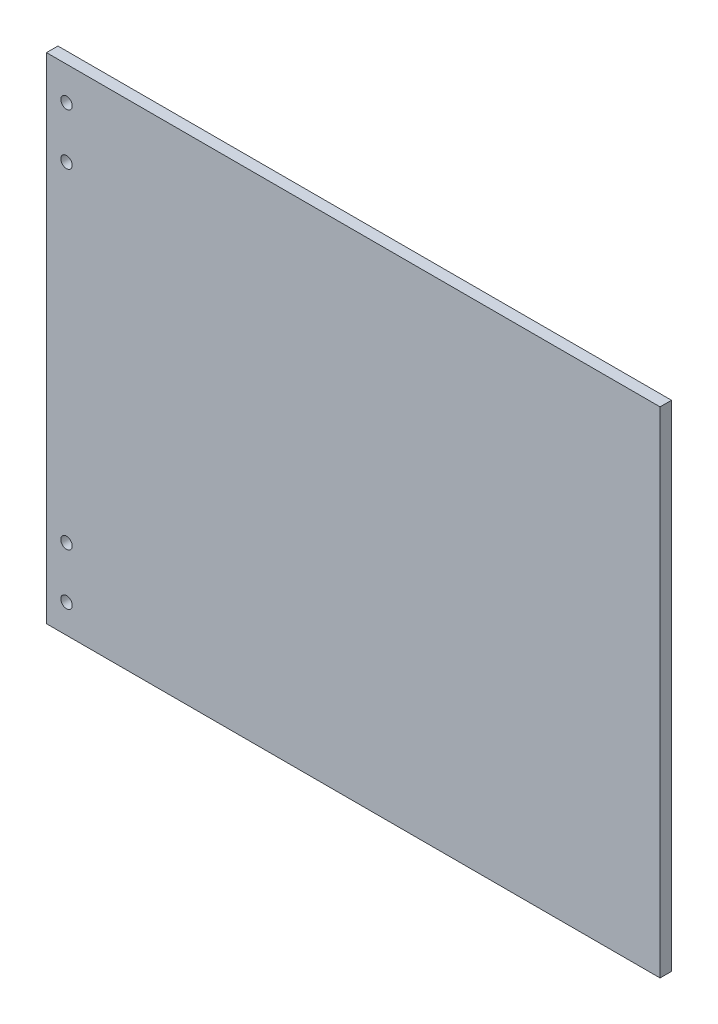
ISO-10303-21;
HEADER;
FILE_DESCRIPTION(('STEP AP214'),'2;1');
FILE_NAME('part.step','',(''),(''),'','','');
FILE_SCHEMA(('AUTOMOTIVE_DESIGN { 1 0 10303 214 1 1 1 1 }'));
ENDSEC;
DATA;
#1=APPLICATION_CONTEXT('core data for automotive mechanical design processes');
#2=APPLICATION_PROTOCOL_DEFINITION('international standard','automotive_design',2000,#1);
#3=PRODUCT_CONTEXT('',#1,'mechanical');
#4=PRODUCT('Part','Part','',(#3));
#5=PRODUCT_RELATED_PRODUCT_CATEGORY('part','',(#4));
#6=PRODUCT_DEFINITION_FORMATION('','',#4);
#7=PRODUCT_DEFINITION_CONTEXT('part definition',#1,'design');
#8=PRODUCT_DEFINITION('design','',#6,#7);
#9=PRODUCT_DEFINITION_SHAPE('','',#8);
#10=(LENGTH_UNIT() NAMED_UNIT(*) SI_UNIT(.MILLI.,.METRE.));
#11=(NAMED_UNIT(*) PLANE_ANGLE_UNIT() SI_UNIT($,.RADIAN.));
#12=(NAMED_UNIT(*) SI_UNIT($,.STERADIAN.) SOLID_ANGLE_UNIT());
#13=UNCERTAINTY_MEASURE_WITH_UNIT(LENGTH_MEASURE(1.E-05),#10,'distance_accuracy_value','');
#14=(GEOMETRIC_REPRESENTATION_CONTEXT(3) GLOBAL_UNCERTAINTY_ASSIGNED_CONTEXT((#13)) GLOBAL_UNIT_ASSIGNED_CONTEXT((#10,
#11,#12)) REPRESENTATION_CONTEXT('',''));
#15=CARTESIAN_POINT('',(0.,0.,0.));
#16=DIRECTION('',(0.,0.,1.));
#17=DIRECTION('',(1.,0.,0.));
#18=AXIS2_PLACEMENT_3D('',#15,#16,#17);
#19=CARTESIAN_POINT('',(-5.94461538461539,-5.94461538461539,6.));
#20=DIRECTION('',(1.,0.,0.));
#21=DIRECTION('',(0.,0.,-1.));
#22=AXIS2_PLACEMENT_3D('',#19,#20,#21);
#23=PLANE('',#22);
#24=DIRECTION('',(0.,-1.,0.));
#25=VECTOR('',#24,1.);
#26=CARTESIAN_POINT('',(-5.94461538461539,-5.94461538461539,0.));
#27=LINE('',#26,#25);
#28=CARTESIAN_POINT('',(-5.94461538461539,253.636923076923,0.));
#29=VERTEX_POINT('',#28);
#30=CARTESIAN_POINT('',(-5.94461538461539,-5.94461538461539,0.));
#31=VERTEX_POINT('',#30);
#32=EDGE_CURVE('E96',#29,#31,#27,.T.);
#33=ORIENTED_EDGE('',*,*,#32,.T.);
#34=DIRECTION('',(0.,0.,-1.));
#35=VECTOR('',#34,1.);
#36=CARTESIAN_POINT('',(-5.94461538461539,-5.94461538461539,6.));
#37=LINE('',#36,#35);
#38=CARTESIAN_POINT('',(-5.94461538461539,-5.94461538461539,6.));
#39=VERTEX_POINT('',#38);
#40=EDGE_CURVE('E11',#39,#31,#37,.T.);
#41=ORIENTED_EDGE('',*,*,#40,.F.);
#42=DIRECTION('',(0.,-1.,0.));
#43=VECTOR('',#42,1.);
#44=CARTESIAN_POINT('',(-5.94461538461539,-5.94461538461539,6.));
#45=LINE('',#44,#43);
#46=CARTESIAN_POINT('',(-5.94461538461539,253.636923076923,6.));
#47=VERTEX_POINT('',#46);
#48=EDGE_CURVE('E84',#47,#39,#45,.T.);
#49=ORIENTED_EDGE('',*,*,#48,.F.);
#50=DIRECTION('',(0.,0.,-1.));
#51=VECTOR('',#50,1.);
#52=CARTESIAN_POINT('',(-5.94461538461539,253.636923076923,6.));
#53=LINE('',#52,#51);
#54=EDGE_CURVE('E92',#47,#29,#53,.T.);
#55=ORIENTED_EDGE('',*,*,#54,.T.);
#56=EDGE_LOOP('',(#33,#41,#49,#55));
#57=FACE_BOUND('',#56,.T.);
#58=ADVANCED_FACE('F33',(#57),#23,.F.);
#59=CARTESIAN_POINT('',(-5.94461538461539,-5.94461538461539,6.));
#60=DIRECTION('',(0.,1.,0.));
#61=DIRECTION('',(0.,0.,1.));
#62=AXIS2_PLACEMENT_3D('',#59,#60,#61);
#63=PLANE('',#62);
#64=DIRECTION('',(1.,0.,0.));
#65=VECTOR('',#64,1.);
#66=CARTESIAN_POINT('',(-5.94461538461539,-5.94461538461539,0.));
#67=LINE('',#66,#65);
#68=CARTESIAN_POINT('',(316.055384615385,-5.94461538461539,0.));
#69=VERTEX_POINT('',#68);
#70=EDGE_CURVE('E88',#31,#69,#67,.T.);
#71=ORIENTED_EDGE('',*,*,#70,.T.);
#72=DIRECTION('',(0.,0.,-1.));
#73=VECTOR('',#72,1.);
#74=CARTESIAN_POINT('',(316.055384615385,-5.94461538461539,6.));
#75=LINE('',#74,#73);
#76=CARTESIAN_POINT('',(316.055384615385,-5.94461538461539,6.));
#77=VERTEX_POINT('',#76);
#78=EDGE_CURVE('E41',#77,#69,#75,.T.);
#79=ORIENTED_EDGE('',*,*,#78,.F.);
#80=DIRECTION('',(1.,0.,0.));
#81=VECTOR('',#80,1.);
#82=CARTESIAN_POINT('',(-5.94461538461539,-5.94461538461539,6.));
#83=LINE('',#82,#81);
#84=EDGE_CURVE('E79',#39,#77,#83,.T.);
#85=ORIENTED_EDGE('',*,*,#84,.F.);
#86=ORIENTED_EDGE('',*,*,#40,.T.);
#87=EDGE_LOOP('',(#71,#79,#85,#86));
#88=FACE_BOUND('',#87,.T.);
#89=ADVANCED_FACE('F87',(#88),#63,.F.);
#90=CARTESIAN_POINT('',(316.055384615385,-5.94461538461539,6.));
#91=DIRECTION('',(-1.,0.,0.));
#92=DIRECTION('',(0.,0.,1.));
#93=AXIS2_PLACEMENT_3D('',#90,#91,#92);
#94=PLANE('',#93);
#95=DIRECTION('',(0.,1.,0.));
#96=VECTOR('',#95,1.);
#97=CARTESIAN_POINT('',(316.055384615385,-5.94461538461539,0.));
#98=LINE('',#97,#96);
#99=CARTESIAN_POINT('',(316.055384615385,253.636923076923,0.));
#100=VERTEX_POINT('',#99);
#101=EDGE_CURVE('E66',#69,#100,#98,.T.);
#102=ORIENTED_EDGE('',*,*,#101,.T.);
#103=DIRECTION('',(0.,0.,-1.));
#104=VECTOR('',#103,1.);
#105=CARTESIAN_POINT('',(316.055384615385,253.636923076923,6.));
#106=LINE('',#105,#104);
#107=CARTESIAN_POINT('',(316.055384615385,253.636923076923,6.));
#108=VERTEX_POINT('',#107);
#109=EDGE_CURVE('E89',#108,#100,#106,.T.);
#110=ORIENTED_EDGE('',*,*,#109,.F.);
#111=DIRECTION('',(0.,1.,0.));
#112=VECTOR('',#111,1.);
#113=CARTESIAN_POINT('',(316.055384615385,-5.94461538461539,6.));
#114=LINE('',#113,#112);
#115=EDGE_CURVE('E82',#77,#108,#114,.T.);
#116=ORIENTED_EDGE('',*,*,#115,.F.);
#117=ORIENTED_EDGE('',*,*,#78,.T.);
#118=EDGE_LOOP('',(#102,#110,#116,#117));
#119=FACE_BOUND('',#118,.T.);
#120=ADVANCED_FACE('F90',(#119),#94,.F.);
#121=CARTESIAN_POINT('',(-5.94461538461539,253.636923076923,6.));
#122=DIRECTION('',(0.,-1.,0.));
#123=DIRECTION('',(0.,0.,-1.));
#124=AXIS2_PLACEMENT_3D('',#121,#122,#123);
#125=PLANE('',#124);
#126=DIRECTION('',(-1.,0.,0.));
#127=VECTOR('',#126,1.);
#128=CARTESIAN_POINT('',(-5.94461538461539,253.636923076923,0.));
#129=LINE('',#128,#127);
#130=EDGE_CURVE('E72',#100,#29,#129,.T.);
#131=ORIENTED_EDGE('',*,*,#130,.T.);
#132=ORIENTED_EDGE('',*,*,#54,.F.);
#133=DIRECTION('',(-1.,0.,0.));
#134=VECTOR('',#133,1.);
#135=CARTESIAN_POINT('',(-5.94461538461539,253.636923076923,6.));
#136=LINE('',#135,#134);
#137=EDGE_CURVE('E49',#108,#47,#136,.T.);
#138=ORIENTED_EDGE('',*,*,#137,.F.);
#139=ORIENTED_EDGE('',*,*,#109,.T.);
#140=EDGE_LOOP('',(#131,#132,#138,#139));
#141=FACE_BOUND('',#140,.T.);
#142=ADVANCED_FACE('F104',(#141),#125,.F.);
#143=CARTESIAN_POINT('',(0.,0.,6.));
#144=DIRECTION('',(0.,0.,-1.));
#145=DIRECTION('',(-1.,0.,0.));
#146=AXIS2_PLACEMENT_3D('',#143,#144,#145);
#147=PLANE('',#146);
#148=CARTESIAN_POINT('',(4.55538461538469,236.136923076923,6.));
#149=DIRECTION('',(0.,0.,-1.));
#150=DIRECTION('',(-1.,0.,0.));
#151=AXIS2_PLACEMENT_3D('',#148,#149,#150);
#152=CIRCLE('',#151,3.);
#153=CARTESIAN_POINT('',(1.55538461538469,236.136923076923,6.));
#154=VERTEX_POINT('',#153);
#155=EDGE_CURVE('E99',#154,#154,#152,.F.);
#156=ORIENTED_EDGE('',*,*,#155,.F.);
#157=EDGE_LOOP('',(#156));
#158=FACE_BOUND('',#157,.T.);
#159=CARTESIAN_POINT('',(4.55538461538469,209.136923076923,6.));
#160=DIRECTION('',(0.,0.,-1.));
#161=DIRECTION('',(-1.,0.,0.));
#162=AXIS2_PLACEMENT_3D('',#159,#160,#161);
#163=CIRCLE('',#162,3.);
#164=CARTESIAN_POINT('',(1.55538461538469,209.136923076923,6.));
#165=VERTEX_POINT('',#164);
#166=EDGE_CURVE('E123',#165,#165,#163,.F.);
#167=ORIENTED_EDGE('',*,*,#166,.F.);
#168=EDGE_LOOP('',(#167));
#169=FACE_BOUND('',#168,.T.);
#170=CARTESIAN_POINT('',(4.55538461538468,36.1369230769232,6.));
#171=DIRECTION('',(0.,0.,-1.));
#172=DIRECTION('',(-1.,0.,0.));
#173=AXIS2_PLACEMENT_3D('',#170,#171,#172);
#174=CIRCLE('',#173,3.);
#175=CARTESIAN_POINT('',(1.55538461538468,36.1369230769232,6.));
#176=VERTEX_POINT('',#175);
#177=EDGE_CURVE('E117',#176,#176,#174,.F.);
#178=ORIENTED_EDGE('',*,*,#177,.F.);
#179=EDGE_LOOP('',(#178));
#180=FACE_BOUND('',#179,.T.);
#181=CARTESIAN_POINT('',(4.55538461538468,9.13692307692324,6.));
#182=DIRECTION('',(0.,0.,-1.));
#183=DIRECTION('',(-1.,0.,0.));
#184=AXIS2_PLACEMENT_3D('',#181,#182,#183);
#185=CIRCLE('',#184,3.);
#186=CARTESIAN_POINT('',(1.55538461538468,9.13692307692324,6.));
#187=VERTEX_POINT('',#186);
#188=EDGE_CURVE('E110',#187,#187,#185,.F.);
#189=ORIENTED_EDGE('',*,*,#188,.F.);
#190=EDGE_LOOP('',(#189));
#191=FACE_BOUND('',#190,.T.);
#192=ORIENTED_EDGE('',*,*,#48,.T.);
#193=ORIENTED_EDGE('',*,*,#84,.T.);
#194=ORIENTED_EDGE('',*,*,#115,.T.);
#195=ORIENTED_EDGE('',*,*,#137,.T.);
#196=EDGE_LOOP('',(#192,#193,#194,#195));
#197=FACE_BOUND('',#196,.T.);
#198=ADVANCED_FACE('F80',(#158,#169,#180,#191,#197),#147,.F.);
#199=CARTESIAN_POINT('',(0.,0.,0.));
#200=DIRECTION('',(0.,0.,-1.));
#201=DIRECTION('',(-1.,0.,0.));
#202=AXIS2_PLACEMENT_3D('',#199,#200,#201);
#203=PLANE('',#202);
#204=CARTESIAN_POINT('',(4.55538461538469,236.136923076923,0.));
#205=DIRECTION('',(0.,0.,-1.));
#206=DIRECTION('',(-1.,0.,0.));
#207=AXIS2_PLACEMENT_3D('',#204,#205,#206);
#208=CIRCLE('',#207,3.);
#209=CARTESIAN_POINT('',(1.55538461538469,236.136923076923,0.));
#210=VERTEX_POINT('',#209);
#211=EDGE_CURVE('E126',#210,#210,#208,.T.);
#212=ORIENTED_EDGE('',*,*,#211,.F.);
#213=EDGE_LOOP('',(#212));
#214=FACE_BOUND('',#213,.T.);
#215=CARTESIAN_POINT('',(4.55538461538469,209.136923076923,0.));
#216=DIRECTION('',(0.,0.,-1.));
#217=DIRECTION('',(-1.,0.,0.));
#218=AXIS2_PLACEMENT_3D('',#215,#216,#217);
#219=CIRCLE('',#218,3.);
#220=CARTESIAN_POINT('',(1.55538461538469,209.136923076923,0.));
#221=VERTEX_POINT('',#220);
#222=EDGE_CURVE('E120',#221,#221,#219,.T.);
#223=ORIENTED_EDGE('',*,*,#222,.F.);
#224=EDGE_LOOP('',(#223));
#225=FACE_BOUND('',#224,.T.);
#226=CARTESIAN_POINT('',(4.55538461538468,36.1369230769232,0.));
#227=DIRECTION('',(0.,0.,-1.));
#228=DIRECTION('',(-1.,0.,0.));
#229=AXIS2_PLACEMENT_3D('',#226,#227,#228);
#230=CIRCLE('',#229,3.);
#231=CARTESIAN_POINT('',(1.55538461538468,36.1369230769232,0.));
#232=VERTEX_POINT('',#231);
#233=EDGE_CURVE('E113',#232,#232,#230,.T.);
#234=ORIENTED_EDGE('',*,*,#233,.F.);
#235=EDGE_LOOP('',(#234));
#236=FACE_BOUND('',#235,.T.);
#237=CARTESIAN_POINT('',(4.55538461538468,9.13692307692324,0.));
#238=DIRECTION('',(0.,0.,-1.));
#239=DIRECTION('',(-1.,0.,0.));
#240=AXIS2_PLACEMENT_3D('',#237,#238,#239);
#241=CIRCLE('',#240,3.);
#242=CARTESIAN_POINT('',(1.55538461538468,9.13692307692324,0.));
#243=VERTEX_POINT('',#242);
#244=EDGE_CURVE('E114',#243,#243,#241,.T.);
#245=ORIENTED_EDGE('',*,*,#244,.F.);
#246=EDGE_LOOP('',(#245));
#247=FACE_BOUND('',#246,.T.);
#248=ORIENTED_EDGE('',*,*,#32,.F.);
#249=ORIENTED_EDGE('',*,*,#130,.F.);
#250=ORIENTED_EDGE('',*,*,#101,.F.);
#251=ORIENTED_EDGE('',*,*,#70,.F.);
#252=EDGE_LOOP('',(#248,#249,#250,#251));
#253=FACE_BOUND('',#252,.T.);
#254=ADVANCED_FACE('F107',(#214,#225,#236,#247,#253),#203,.T.);
#255=CARTESIAN_POINT('',(4.55538461538468,9.13692307692324,6.001));
#256=DIRECTION('',(0.,0.,-1.));
#257=DIRECTION('',(-1.,0.,0.));
#258=AXIS2_PLACEMENT_3D('',#255,#256,#257);
#259=CYLINDRICAL_SURFACE('',#258,3.);
#260=CARTESIAN_POINT('',(1.55538461538468,9.13692307692324,0.));
#261=CARTESIAN_POINT('',(1.55538461538468,9.13692307692324,0.0625000000000001));
#262=CARTESIAN_POINT('',(1.55538461538468,9.13692307692324,0.125));
#263=CARTESIAN_POINT('',(1.55538461538468,9.13692307692324,0.25));
#264=CARTESIAN_POINT('',(1.55538461538468,9.13692307692324,0.3125));
#265=CARTESIAN_POINT('',(1.55538461538468,9.13692307692324,0.4375));
#266=CARTESIAN_POINT('',(1.55538461538468,9.13692307692324,0.5));
#267=CARTESIAN_POINT('',(1.55538461538468,9.13692307692324,0.625000000000001));
#268=CARTESIAN_POINT('',(1.55538461538468,9.13692307692324,0.687500000000001));
#269=CARTESIAN_POINT('',(1.55538461538468,9.13692307692324,0.8125));
#270=CARTESIAN_POINT('',(1.55538461538468,9.13692307692324,0.875));
#271=CARTESIAN_POINT('',(1.55538461538468,9.13692307692324,1.));
#272=CARTESIAN_POINT('',(1.55538461538468,9.13692307692324,1.0625));
#273=CARTESIAN_POINT('',(1.55538461538468,9.13692307692324,1.1875));
#274=CARTESIAN_POINT('',(1.55538461538468,9.13692307692324,1.25));
#275=CARTESIAN_POINT('',(1.55538461538468,9.13692307692324,1.375));
#276=CARTESIAN_POINT('',(1.55538461538468,9.13692307692324,1.4375));
#277=CARTESIAN_POINT('',(1.55538461538468,9.13692307692324,1.5625));
#278=CARTESIAN_POINT('',(1.55538461538468,9.13692307692324,1.625));
#279=CARTESIAN_POINT('',(1.55538461538468,9.13692307692324,1.75));
#280=CARTESIAN_POINT('',(1.55538461538468,9.13692307692324,1.8125));
#281=CARTESIAN_POINT('',(1.55538461538468,9.13692307692324,1.9375));
#282=CARTESIAN_POINT('',(1.55538461538468,9.13692307692324,2.));
#283=CARTESIAN_POINT('',(1.55538461538468,9.13692307692324,2.125));
#284=CARTESIAN_POINT('',(1.55538461538468,9.13692307692324,2.1875));
#285=CARTESIAN_POINT('',(1.55538461538468,9.13692307692324,2.3125));
#286=CARTESIAN_POINT('',(1.55538461538468,9.13692307692324,2.375));
#287=CARTESIAN_POINT('',(1.55538461538468,9.13692307692324,2.5));
#288=CARTESIAN_POINT('',(1.55538461538468,9.13692307692324,2.5625));
#289=CARTESIAN_POINT('',(1.55538461538468,9.13692307692324,2.6875));
#290=CARTESIAN_POINT('',(1.55538461538468,9.13692307692324,2.75));
#291=CARTESIAN_POINT('',(1.55538461538468,9.13692307692324,2.875));
#292=CARTESIAN_POINT('',(1.55538461538468,9.13692307692324,2.9375));
#293=CARTESIAN_POINT('',(1.55538461538468,9.13692307692324,3.0625));
#294=CARTESIAN_POINT('',(1.55538461538468,9.13692307692324,3.125));
#295=CARTESIAN_POINT('',(1.55538461538468,9.13692307692324,3.25));
#296=CARTESIAN_POINT('',(1.55538461538468,9.13692307692324,3.3125));
#297=CARTESIAN_POINT('',(1.55538461538468,9.13692307692324,3.4375));
#298=CARTESIAN_POINT('',(1.55538461538468,9.13692307692324,3.5));
#299=CARTESIAN_POINT('',(1.55538461538468,9.13692307692324,3.625));
#300=CARTESIAN_POINT('',(1.55538461538468,9.13692307692324,3.6875));
#301=CARTESIAN_POINT('',(1.55538461538468,9.13692307692324,3.8125));
#302=CARTESIAN_POINT('',(1.55538461538468,9.13692307692324,3.875));
#303=CARTESIAN_POINT('',(1.55538461538468,9.13692307692324,4.));
#304=CARTESIAN_POINT('',(1.55538461538468,9.13692307692324,4.0625));
#305=CARTESIAN_POINT('',(1.55538461538468,9.13692307692324,4.1875));
#306=CARTESIAN_POINT('',(1.55538461538468,9.13692307692324,4.25));
#307=CARTESIAN_POINT('',(1.55538461538468,9.13692307692324,4.375));
#308=CARTESIAN_POINT('',(1.55538461538468,9.13692307692324,4.4375));
#309=CARTESIAN_POINT('',(1.55538461538468,9.13692307692324,4.5625));
#310=CARTESIAN_POINT('',(1.55538461538468,9.13692307692324,4.625));
#311=CARTESIAN_POINT('',(1.55538461538468,9.13692307692324,4.75));
#312=CARTESIAN_POINT('',(1.55538461538468,9.13692307692324,4.8125));
#313=CARTESIAN_POINT('',(1.55538461538468,9.13692307692324,4.9375));
#314=CARTESIAN_POINT('',(1.55538461538468,9.13692307692324,5.));
#315=CARTESIAN_POINT('',(1.55538461538468,9.13692307692324,5.125));
#316=CARTESIAN_POINT('',(1.55538461538468,9.13692307692324,5.1875));
#317=CARTESIAN_POINT('',(1.55538461538468,9.13692307692324,5.3125));
#318=CARTESIAN_POINT('',(1.55538461538468,9.13692307692324,5.375));
#319=CARTESIAN_POINT('',(1.55538461538468,9.13692307692324,5.5));
#320=CARTESIAN_POINT('',(1.55538461538468,9.13692307692324,5.5625));
#321=CARTESIAN_POINT('',(1.55538461538468,9.13692307692324,5.6875));
#322=CARTESIAN_POINT('',(1.55538461538468,9.13692307692324,5.75));
#323=CARTESIAN_POINT('',(1.55538461538468,9.13692307692324,5.875));
#324=CARTESIAN_POINT('',(1.55538461538468,9.13692307692324,5.9375));
#325=CARTESIAN_POINT('',(1.55538461538468,9.13692307692324,6.));
#326=B_SPLINE_CURVE_WITH_KNOTS('',3,(#260,#261,#262,#263,#264,#265,#266,#267,#268,#269,#270,
#271,#272,#273,#274,#275,#276,#277,#278,#279,#280,#281,#282,#283,#284,#285,#286,#287,#288,#289,
#290,#291,#292,#293,#294,#295,#296,#297,#298,#299,#300,#301,#302,#303,#304,#305,#306,#307,#308,
#309,#310,#311,#312,#313,#314,#315,#316,#317,#318,#319,#320,#321,#322,#323,#324,#325),
.UNSPECIFIED.,.F.,.F.,(4,2,2,2,2,2,2,2,2,2,2,2,2,2,2,2,2,2,2,2,2,2,2,2,2,2,2,2,2,2,2,2,4),(0.,
0.1875,0.375,0.5625,0.750000000000001,0.9375,1.125,1.3125,1.5,1.6875,1.875,2.0625,2.25,2.4375,
2.625,2.8125,3.,3.1875,3.375,3.5625,3.75,3.9375,4.125,4.3125,4.5,4.6875,4.875,5.0625,5.25,
5.4375,5.625,5.8125,6.),.UNSPECIFIED.);
#327=EDGE_CURVE('BSEAM139',#243,#187,#326,.T.);
#328=ORIENTED_EDGE('',*,*,#244,.T.);
#329=ORIENTED_EDGE('',*,*,#188,.T.);
#330=ORIENTED_EDGE('',*,*,#327,.T.);
#331=ORIENTED_EDGE('',*,*,#327,.F.);
#332=EDGE_LOOP('',(#328,#330,#329,#331));
#333=FACE_BOUND('',#332,.T.);
#334=ADVANCED_FACE('F139',(#333),#259,.F.);
#335=CARTESIAN_POINT('',(4.55538461538468,36.1369230769232,6.001));
#336=DIRECTION('',(0.,0.,-1.));
#337=DIRECTION('',(-1.,0.,0.));
#338=AXIS2_PLACEMENT_3D('',#335,#336,#337);
#339=CYLINDRICAL_SURFACE('',#338,3.);
#340=CARTESIAN_POINT('',(1.55538461538468,36.1369230769232,0.));
#341=CARTESIAN_POINT('',(1.55538461538468,36.1369230769232,0.0625000000000001));
#342=CARTESIAN_POINT('',(1.55538461538468,36.1369230769232,0.125));
#343=CARTESIAN_POINT('',(1.55538461538468,36.1369230769232,0.25));
#344=CARTESIAN_POINT('',(1.55538461538468,36.1369230769232,0.3125));
#345=CARTESIAN_POINT('',(1.55538461538468,36.1369230769232,0.4375));
#346=CARTESIAN_POINT('',(1.55538461538468,36.1369230769232,0.5));
#347=CARTESIAN_POINT('',(1.55538461538468,36.1369230769232,0.625000000000001));
#348=CARTESIAN_POINT('',(1.55538461538468,36.1369230769232,0.687500000000001));
#349=CARTESIAN_POINT('',(1.55538461538468,36.1369230769232,0.8125));
#350=CARTESIAN_POINT('',(1.55538461538468,36.1369230769232,0.875));
#351=CARTESIAN_POINT('',(1.55538461538468,36.1369230769232,1.));
#352=CARTESIAN_POINT('',(1.55538461538468,36.1369230769232,1.0625));
#353=CARTESIAN_POINT('',(1.55538461538468,36.1369230769232,1.1875));
#354=CARTESIAN_POINT('',(1.55538461538468,36.1369230769232,1.25));
#355=CARTESIAN_POINT('',(1.55538461538468,36.1369230769232,1.375));
#356=CARTESIAN_POINT('',(1.55538461538468,36.1369230769232,1.4375));
#357=CARTESIAN_POINT('',(1.55538461538468,36.1369230769232,1.5625));
#358=CARTESIAN_POINT('',(1.55538461538468,36.1369230769232,1.625));
#359=CARTESIAN_POINT('',(1.55538461538468,36.1369230769232,1.75));
#360=CARTESIAN_POINT('',(1.55538461538468,36.1369230769232,1.8125));
#361=CARTESIAN_POINT('',(1.55538461538468,36.1369230769232,1.9375));
#362=CARTESIAN_POINT('',(1.55538461538468,36.1369230769232,2.));
#363=CARTESIAN_POINT('',(1.55538461538468,36.1369230769232,2.125));
#364=CARTESIAN_POINT('',(1.55538461538468,36.1369230769232,2.1875));
#365=CARTESIAN_POINT('',(1.55538461538468,36.1369230769232,2.3125));
#366=CARTESIAN_POINT('',(1.55538461538468,36.1369230769232,2.375));
#367=CARTESIAN_POINT('',(1.55538461538468,36.1369230769232,2.5));
#368=CARTESIAN_POINT('',(1.55538461538468,36.1369230769232,2.5625));
#369=CARTESIAN_POINT('',(1.55538461538468,36.1369230769232,2.6875));
#370=CARTESIAN_POINT('',(1.55538461538468,36.1369230769232,2.75));
#371=CARTESIAN_POINT('',(1.55538461538468,36.1369230769232,2.875));
#372=CARTESIAN_POINT('',(1.55538461538468,36.1369230769232,2.9375));
#373=CARTESIAN_POINT('',(1.55538461538468,36.1369230769232,3.0625));
#374=CARTESIAN_POINT('',(1.55538461538468,36.1369230769232,3.125));
#375=CARTESIAN_POINT('',(1.55538461538468,36.1369230769232,3.25));
#376=CARTESIAN_POINT('',(1.55538461538468,36.1369230769232,3.3125));
#377=CARTESIAN_POINT('',(1.55538461538468,36.1369230769232,3.4375));
#378=CARTESIAN_POINT('',(1.55538461538468,36.1369230769232,3.5));
#379=CARTESIAN_POINT('',(1.55538461538468,36.1369230769232,3.625));
#380=CARTESIAN_POINT('',(1.55538461538468,36.1369230769232,3.6875));
#381=CARTESIAN_POINT('',(1.55538461538468,36.1369230769232,3.8125));
#382=CARTESIAN_POINT('',(1.55538461538468,36.1369230769232,3.875));
#383=CARTESIAN_POINT('',(1.55538461538468,36.1369230769232,4.));
#384=CARTESIAN_POINT('',(1.55538461538468,36.1369230769232,4.0625));
#385=CARTESIAN_POINT('',(1.55538461538468,36.1369230769232,4.1875));
#386=CARTESIAN_POINT('',(1.55538461538468,36.1369230769232,4.25));
#387=CARTESIAN_POINT('',(1.55538461538468,36.1369230769232,4.375));
#388=CARTESIAN_POINT('',(1.55538461538468,36.1369230769232,4.4375));
#389=CARTESIAN_POINT('',(1.55538461538468,36.1369230769232,4.5625));
#390=CARTESIAN_POINT('',(1.55538461538468,36.1369230769232,4.625));
#391=CARTESIAN_POINT('',(1.55538461538468,36.1369230769232,4.75));
#392=CARTESIAN_POINT('',(1.55538461538468,36.1369230769232,4.8125));
#393=CARTESIAN_POINT('',(1.55538461538468,36.1369230769232,4.9375));
#394=CARTESIAN_POINT('',(1.55538461538468,36.1369230769232,5.));
#395=CARTESIAN_POINT('',(1.55538461538468,36.1369230769232,5.125));
#396=CARTESIAN_POINT('',(1.55538461538468,36.1369230769232,5.1875));
#397=CARTESIAN_POINT('',(1.55538461538468,36.1369230769232,5.3125));
#398=CARTESIAN_POINT('',(1.55538461538468,36.1369230769232,5.375));
#399=CARTESIAN_POINT('',(1.55538461538468,36.1369230769232,5.5));
#400=CARTESIAN_POINT('',(1.55538461538468,36.1369230769232,5.5625));
#401=CARTESIAN_POINT('',(1.55538461538468,36.1369230769232,5.6875));
#402=CARTESIAN_POINT('',(1.55538461538468,36.1369230769232,5.75));
#403=CARTESIAN_POINT('',(1.55538461538468,36.1369230769232,5.875));
#404=CARTESIAN_POINT('',(1.55538461538468,36.1369230769232,5.9375));
#405=CARTESIAN_POINT('',(1.55538461538468,36.1369230769232,6.));
#406=B_SPLINE_CURVE_WITH_KNOTS('',3,(#340,#341,#342,#343,#344,#345,#346,#347,#348,#349,#350,
#351,#352,#353,#354,#355,#356,#357,#358,#359,#360,#361,#362,#363,#364,#365,#366,#367,#368,#369,
#370,#371,#372,#373,#374,#375,#376,#377,#378,#379,#380,#381,#382,#383,#384,#385,#386,#387,#388,
#389,#390,#391,#392,#393,#394,#395,#396,#397,#398,#399,#400,#401,#402,#403,#404,#405),
.UNSPECIFIED.,.F.,.F.,(4,2,2,2,2,2,2,2,2,2,2,2,2,2,2,2,2,2,2,2,2,2,2,2,2,2,2,2,2,2,2,2,4),(0.,
0.1875,0.375,0.5625,0.750000000000001,0.9375,1.125,1.3125,1.5,1.6875,1.875,2.0625,2.25,2.4375,
2.625,2.8125,3.,3.1875,3.375,3.5625,3.75,3.9375,4.125,4.3125,4.5,4.6875,4.875,5.0625,5.25,
5.4375,5.625,5.8125,6.),.UNSPECIFIED.);
#407=EDGE_CURVE('BSEAM149',#232,#176,#406,.T.);
#408=ORIENTED_EDGE('',*,*,#233,.T.);
#409=ORIENTED_EDGE('',*,*,#177,.T.);
#410=ORIENTED_EDGE('',*,*,#407,.T.);
#411=ORIENTED_EDGE('',*,*,#407,.F.);
#412=EDGE_LOOP('',(#408,#410,#409,#411));
#413=FACE_BOUND('',#412,.T.);
#414=ADVANCED_FACE('F149',(#413),#339,.F.);
#415=CARTESIAN_POINT('',(4.55538461538469,209.136923076923,6.001));
#416=DIRECTION('',(0.,0.,-1.));
#417=DIRECTION('',(-1.,0.,0.));
#418=AXIS2_PLACEMENT_3D('',#415,#416,#417);
#419=CYLINDRICAL_SURFACE('',#418,3.);
#420=CARTESIAN_POINT('',(1.55538461538469,209.136923076923,0.));
#421=CARTESIAN_POINT('',(1.55538461538469,209.136923076923,0.0625000000000001));
#422=CARTESIAN_POINT('',(1.55538461538469,209.136923076923,0.125));
#423=CARTESIAN_POINT('',(1.55538461538469,209.136923076923,0.25));
#424=CARTESIAN_POINT('',(1.55538461538469,209.136923076923,0.3125));
#425=CARTESIAN_POINT('',(1.55538461538469,209.136923076923,0.4375));
#426=CARTESIAN_POINT('',(1.55538461538469,209.136923076923,0.5));
#427=CARTESIAN_POINT('',(1.55538461538469,209.136923076923,0.625000000000001));
#428=CARTESIAN_POINT('',(1.55538461538469,209.136923076923,0.687500000000001));
#429=CARTESIAN_POINT('',(1.55538461538469,209.136923076923,0.8125));
#430=CARTESIAN_POINT('',(1.55538461538469,209.136923076923,0.875));
#431=CARTESIAN_POINT('',(1.55538461538469,209.136923076923,1.));
#432=CARTESIAN_POINT('',(1.55538461538469,209.136923076923,1.0625));
#433=CARTESIAN_POINT('',(1.55538461538469,209.136923076923,1.1875));
#434=CARTESIAN_POINT('',(1.55538461538469,209.136923076923,1.25));
#435=CARTESIAN_POINT('',(1.55538461538469,209.136923076923,1.375));
#436=CARTESIAN_POINT('',(1.55538461538469,209.136923076923,1.4375));
#437=CARTESIAN_POINT('',(1.55538461538469,209.136923076923,1.5625));
#438=CARTESIAN_POINT('',(1.55538461538469,209.136923076923,1.625));
#439=CARTESIAN_POINT('',(1.55538461538469,209.136923076923,1.75));
#440=CARTESIAN_POINT('',(1.55538461538469,209.136923076923,1.8125));
#441=CARTESIAN_POINT('',(1.55538461538469,209.136923076923,1.9375));
#442=CARTESIAN_POINT('',(1.55538461538469,209.136923076923,2.));
#443=CARTESIAN_POINT('',(1.55538461538469,209.136923076923,2.125));
#444=CARTESIAN_POINT('',(1.55538461538469,209.136923076923,2.1875));
#445=CARTESIAN_POINT('',(1.55538461538469,209.136923076923,2.3125));
#446=CARTESIAN_POINT('',(1.55538461538469,209.136923076923,2.375));
#447=CARTESIAN_POINT('',(1.55538461538469,209.136923076923,2.5));
#448=CARTESIAN_POINT('',(1.55538461538469,209.136923076923,2.5625));
#449=CARTESIAN_POINT('',(1.55538461538469,209.136923076923,2.6875));
#450=CARTESIAN_POINT('',(1.55538461538469,209.136923076923,2.75));
#451=CARTESIAN_POINT('',(1.55538461538469,209.136923076923,2.875));
#452=CARTESIAN_POINT('',(1.55538461538469,209.136923076923,2.9375));
#453=CARTESIAN_POINT('',(1.55538461538469,209.136923076923,3.0625));
#454=CARTESIAN_POINT('',(1.55538461538469,209.136923076923,3.125));
#455=CARTESIAN_POINT('',(1.55538461538469,209.136923076923,3.25));
#456=CARTESIAN_POINT('',(1.55538461538469,209.136923076923,3.3125));
#457=CARTESIAN_POINT('',(1.55538461538469,209.136923076923,3.4375));
#458=CARTESIAN_POINT('',(1.55538461538469,209.136923076923,3.5));
#459=CARTESIAN_POINT('',(1.55538461538469,209.136923076923,3.625));
#460=CARTESIAN_POINT('',(1.55538461538469,209.136923076923,3.6875));
#461=CARTESIAN_POINT('',(1.55538461538469,209.136923076923,3.8125));
#462=CARTESIAN_POINT('',(1.55538461538469,209.136923076923,3.875));
#463=CARTESIAN_POINT('',(1.55538461538469,209.136923076923,4.));
#464=CARTESIAN_POINT('',(1.55538461538469,209.136923076923,4.0625));
#465=CARTESIAN_POINT('',(1.55538461538469,209.136923076923,4.1875));
#466=CARTESIAN_POINT('',(1.55538461538469,209.136923076923,4.25));
#467=CARTESIAN_POINT('',(1.55538461538469,209.136923076923,4.375));
#468=CARTESIAN_POINT('',(1.55538461538469,209.136923076923,4.4375));
#469=CARTESIAN_POINT('',(1.55538461538469,209.136923076923,4.5625));
#470=CARTESIAN_POINT('',(1.55538461538469,209.136923076923,4.625));
#471=CARTESIAN_POINT('',(1.55538461538469,209.136923076923,4.75));
#472=CARTESIAN_POINT('',(1.55538461538469,209.136923076923,4.8125));
#473=CARTESIAN_POINT('',(1.55538461538469,209.136923076923,4.9375));
#474=CARTESIAN_POINT('',(1.55538461538469,209.136923076923,5.));
#475=CARTESIAN_POINT('',(1.55538461538469,209.136923076923,5.125));
#476=CARTESIAN_POINT('',(1.55538461538469,209.136923076923,5.1875));
#477=CARTESIAN_POINT('',(1.55538461538469,209.136923076923,5.3125));
#478=CARTESIAN_POINT('',(1.55538461538469,209.136923076923,5.375));
#479=CARTESIAN_POINT('',(1.55538461538469,209.136923076923,5.5));
#480=CARTESIAN_POINT('',(1.55538461538469,209.136923076923,5.5625));
#481=CARTESIAN_POINT('',(1.55538461538469,209.136923076923,5.6875));
#482=CARTESIAN_POINT('',(1.55538461538469,209.136923076923,5.75));
#483=CARTESIAN_POINT('',(1.55538461538469,209.136923076923,5.875));
#484=CARTESIAN_POINT('',(1.55538461538469,209.136923076923,5.9375));
#485=CARTESIAN_POINT('',(1.55538461538469,209.136923076923,6.));
#486=B_SPLINE_CURVE_WITH_KNOTS('',3,(#420,#421,#422,#423,#424,#425,#426,#427,#428,#429,#430,
#431,#432,#433,#434,#435,#436,#437,#438,#439,#440,#441,#442,#443,#444,#445,#446,#447,#448,#449,
#450,#451,#452,#453,#454,#455,#456,#457,#458,#459,#460,#461,#462,#463,#464,#465,#466,#467,#468,
#469,#470,#471,#472,#473,#474,#475,#476,#477,#478,#479,#480,#481,#482,#483,#484,#485),
.UNSPECIFIED.,.F.,.F.,(4,2,2,2,2,2,2,2,2,2,2,2,2,2,2,2,2,2,2,2,2,2,2,2,2,2,2,2,2,2,2,2,4),(0.,
0.1875,0.375,0.5625,0.750000000000001,0.9375,1.125,1.3125,1.5,1.6875,1.875,2.0625,2.25,2.4375,
2.625,2.8125,3.,3.1875,3.375,3.5625,3.75,3.9375,4.125,4.3125,4.5,4.6875,4.875,5.0625,5.25,
5.4375,5.625,5.8125,6.),.UNSPECIFIED.);
#487=EDGE_CURVE('BSEAM201',#221,#165,#486,.T.);
#488=ORIENTED_EDGE('',*,*,#222,.T.);
#489=ORIENTED_EDGE('',*,*,#166,.T.);
#490=ORIENTED_EDGE('',*,*,#487,.T.);
#491=ORIENTED_EDGE('',*,*,#487,.F.);
#492=EDGE_LOOP('',(#488,#490,#489,#491));
#493=FACE_BOUND('',#492,.T.);
#494=ADVANCED_FACE('F201',(#493),#419,.F.);
#495=CARTESIAN_POINT('',(4.55538461538469,236.136923076923,6.001));
#496=DIRECTION('',(0.,0.,-1.));
#497=DIRECTION('',(-1.,0.,0.));
#498=AXIS2_PLACEMENT_3D('',#495,#496,#497);
#499=CYLINDRICAL_SURFACE('',#498,3.);
#500=CARTESIAN_POINT('',(1.55538461538469,236.136923076923,0.));
#501=CARTESIAN_POINT('',(1.55538461538469,236.136923076923,0.0625000000000001));
#502=CARTESIAN_POINT('',(1.55538461538469,236.136923076923,0.125));
#503=CARTESIAN_POINT('',(1.55538461538469,236.136923076923,0.25));
#504=CARTESIAN_POINT('',(1.55538461538469,236.136923076923,0.3125));
#505=CARTESIAN_POINT('',(1.55538461538469,236.136923076923,0.4375));
#506=CARTESIAN_POINT('',(1.55538461538469,236.136923076923,0.5));
#507=CARTESIAN_POINT('',(1.55538461538469,236.136923076923,0.625000000000001));
#508=CARTESIAN_POINT('',(1.55538461538469,236.136923076923,0.687500000000001));
#509=CARTESIAN_POINT('',(1.55538461538469,236.136923076923,0.8125));
#510=CARTESIAN_POINT('',(1.55538461538469,236.136923076923,0.875));
#511=CARTESIAN_POINT('',(1.55538461538469,236.136923076923,1.));
#512=CARTESIAN_POINT('',(1.55538461538469,236.136923076923,1.0625));
#513=CARTESIAN_POINT('',(1.55538461538469,236.136923076923,1.1875));
#514=CARTESIAN_POINT('',(1.55538461538469,236.136923076923,1.25));
#515=CARTESIAN_POINT('',(1.55538461538469,236.136923076923,1.375));
#516=CARTESIAN_POINT('',(1.55538461538469,236.136923076923,1.4375));
#517=CARTESIAN_POINT('',(1.55538461538469,236.136923076923,1.5625));
#518=CARTESIAN_POINT('',(1.55538461538469,236.136923076923,1.625));
#519=CARTESIAN_POINT('',(1.55538461538469,236.136923076923,1.75));
#520=CARTESIAN_POINT('',(1.55538461538469,236.136923076923,1.8125));
#521=CARTESIAN_POINT('',(1.55538461538469,236.136923076923,1.9375));
#522=CARTESIAN_POINT('',(1.55538461538469,236.136923076923,2.));
#523=CARTESIAN_POINT('',(1.55538461538469,236.136923076923,2.125));
#524=CARTESIAN_POINT('',(1.55538461538469,236.136923076923,2.1875));
#525=CARTESIAN_POINT('',(1.55538461538469,236.136923076923,2.3125));
#526=CARTESIAN_POINT('',(1.55538461538469,236.136923076923,2.375));
#527=CARTESIAN_POINT('',(1.55538461538469,236.136923076923,2.5));
#528=CARTESIAN_POINT('',(1.55538461538469,236.136923076923,2.5625));
#529=CARTESIAN_POINT('',(1.55538461538469,236.136923076923,2.6875));
#530=CARTESIAN_POINT('',(1.55538461538469,236.136923076923,2.75));
#531=CARTESIAN_POINT('',(1.55538461538469,236.136923076923,2.875));
#532=CARTESIAN_POINT('',(1.55538461538469,236.136923076923,2.9375));
#533=CARTESIAN_POINT('',(1.55538461538469,236.136923076923,3.0625));
#534=CARTESIAN_POINT('',(1.55538461538469,236.136923076923,3.125));
#535=CARTESIAN_POINT('',(1.55538461538469,236.136923076923,3.25));
#536=CARTESIAN_POINT('',(1.55538461538469,236.136923076923,3.3125));
#537=CARTESIAN_POINT('',(1.55538461538469,236.136923076923,3.4375));
#538=CARTESIAN_POINT('',(1.55538461538469,236.136923076923,3.5));
#539=CARTESIAN_POINT('',(1.55538461538469,236.136923076923,3.625));
#540=CARTESIAN_POINT('',(1.55538461538469,236.136923076923,3.6875));
#541=CARTESIAN_POINT('',(1.55538461538469,236.136923076923,3.8125));
#542=CARTESIAN_POINT('',(1.55538461538469,236.136923076923,3.875));
#543=CARTESIAN_POINT('',(1.55538461538469,236.136923076923,4.));
#544=CARTESIAN_POINT('',(1.55538461538469,236.136923076923,4.0625));
#545=CARTESIAN_POINT('',(1.55538461538469,236.136923076923,4.1875));
#546=CARTESIAN_POINT('',(1.55538461538469,236.136923076923,4.25));
#547=CARTESIAN_POINT('',(1.55538461538469,236.136923076923,4.375));
#548=CARTESIAN_POINT('',(1.55538461538469,236.136923076923,4.4375));
#549=CARTESIAN_POINT('',(1.55538461538469,236.136923076923,4.5625));
#550=CARTESIAN_POINT('',(1.55538461538469,236.136923076923,4.625));
#551=CARTESIAN_POINT('',(1.55538461538469,236.136923076923,4.75));
#552=CARTESIAN_POINT('',(1.55538461538469,236.136923076923,4.8125));
#553=CARTESIAN_POINT('',(1.55538461538469,236.136923076923,4.9375));
#554=CARTESIAN_POINT('',(1.55538461538469,236.136923076923,5.));
#555=CARTESIAN_POINT('',(1.55538461538469,236.136923076923,5.125));
#556=CARTESIAN_POINT('',(1.55538461538469,236.136923076923,5.1875));
#557=CARTESIAN_POINT('',(1.55538461538469,236.136923076923,5.3125));
#558=CARTESIAN_POINT('',(1.55538461538469,236.136923076923,5.375));
#559=CARTESIAN_POINT('',(1.55538461538469,236.136923076923,5.5));
#560=CARTESIAN_POINT('',(1.55538461538469,236.136923076923,5.5625));
#561=CARTESIAN_POINT('',(1.55538461538469,236.136923076923,5.6875));
#562=CARTESIAN_POINT('',(1.55538461538469,236.136923076923,5.75));
#563=CARTESIAN_POINT('',(1.55538461538469,236.136923076923,5.875));
#564=CARTESIAN_POINT('',(1.55538461538469,236.136923076923,5.9375));
#565=CARTESIAN_POINT('',(1.55538461538469,236.136923076923,6.));
#566=B_SPLINE_CURVE_WITH_KNOTS('',3,(#500,#501,#502,#503,#504,#505,#506,#507,#508,#509,#510,
#511,#512,#513,#514,#515,#516,#517,#518,#519,#520,#521,#522,#523,#524,#525,#526,#527,#528,#529,
#530,#531,#532,#533,#534,#535,#536,#537,#538,#539,#540,#541,#542,#543,#544,#545,#546,#547,#548,
#549,#550,#551,#552,#553,#554,#555,#556,#557,#558,#559,#560,#561,#562,#563,#564,#565),
.UNSPECIFIED.,.F.,.F.,(4,2,2,2,2,2,2,2,2,2,2,2,2,2,2,2,2,2,2,2,2,2,2,2,2,2,2,2,2,2,2,2,4),(0.,
0.1875,0.375,0.5625,0.750000000000001,0.9375,1.125,1.3125,1.5,1.6875,1.875,2.0625,2.25,2.4375,
2.625,2.8125,3.,3.1875,3.375,3.5625,3.75,3.9375,4.125,4.3125,4.5,4.6875,4.875,5.0625,5.25,
5.4375,5.625,5.8125,6.),.UNSPECIFIED.);
#567=EDGE_CURVE('BSEAM134',#210,#154,#566,.T.);
#568=ORIENTED_EDGE('',*,*,#211,.T.);
#569=ORIENTED_EDGE('',*,*,#155,.T.);
#570=ORIENTED_EDGE('',*,*,#567,.T.);
#571=ORIENTED_EDGE('',*,*,#567,.F.);
#572=EDGE_LOOP('',(#568,#570,#569,#571));
#573=FACE_BOUND('',#572,.T.);
#574=ADVANCED_FACE('F134',(#573),#499,.F.);
#575=CLOSED_SHELL('',(#58,#89,#120,#142,#198,#254,#334,#414,#494,#574));
#576=MANIFOLD_SOLID_BREP('B2',#575);
#577=ADVANCED_BREP_SHAPE_REPRESENTATION('',(#18,#576),#14);
#578=SHAPE_DEFINITION_REPRESENTATION(#9,#577);
ENDSEC;
END-ISO-10303-21;
